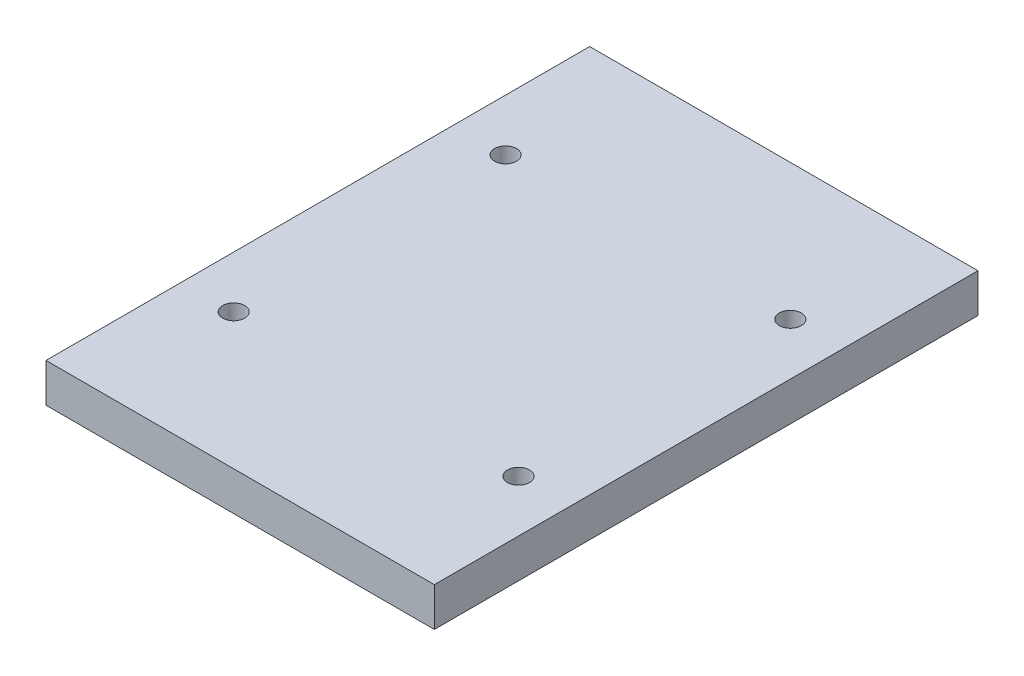
ISO-10303-21;
HEADER;
FILE_DESCRIPTION(('STEP AP214'),'2;1');
FILE_NAME('part.step','',(''),(''),'','','');
FILE_SCHEMA(('AUTOMOTIVE_DESIGN { 1 0 10303 214 1 1 1 1 }'));
ENDSEC;
DATA;
#1=APPLICATION_CONTEXT('core data for automotive mechanical design processes');
#2=APPLICATION_PROTOCOL_DEFINITION('international standard','automotive_design',2000,#1);
#3=PRODUCT_CONTEXT('',#1,'mechanical');
#4=PRODUCT('Part','Part','',(#3));
#5=PRODUCT_RELATED_PRODUCT_CATEGORY('part','',(#4));
#6=PRODUCT_DEFINITION_FORMATION('','',#4);
#7=PRODUCT_DEFINITION_CONTEXT('part definition',#1,'design');
#8=PRODUCT_DEFINITION('design','',#6,#7);
#9=PRODUCT_DEFINITION_SHAPE('','',#8);
#10=(LENGTH_UNIT() NAMED_UNIT(*) SI_UNIT(.MILLI.,.METRE.));
#11=(NAMED_UNIT(*) PLANE_ANGLE_UNIT() SI_UNIT($,.RADIAN.));
#12=(NAMED_UNIT(*) SI_UNIT($,.STERADIAN.) SOLID_ANGLE_UNIT());
#13=UNCERTAINTY_MEASURE_WITH_UNIT(LENGTH_MEASURE(1.E-05),#10,'distance_accuracy_value','');
#14=(GEOMETRIC_REPRESENTATION_CONTEXT(3) GLOBAL_UNCERTAINTY_ASSIGNED_CONTEXT((#13)) GLOBAL_UNIT_ASSIGNED_CONTEXT((#10,
#11,#12)) REPRESENTATION_CONTEXT('',''));
#15=CARTESIAN_POINT('',(0.,0.,0.));
#16=DIRECTION('',(0.,0.,1.));
#17=DIRECTION('',(1.,0.,0.));
#18=AXIS2_PLACEMENT_3D('',#15,#16,#17);
#19=CARTESIAN_POINT('',(0.,-34.4,0.));
#20=DIRECTION('',(0.,1.,0.));
#21=DIRECTION('',(0.,0.,1.));
#22=AXIS2_PLACEMENT_3D('',#19,#20,#21);
#23=PLANE('',#22);
#24=CARTESIAN_POINT('',(-22.,-34.4,49.));
#25=DIRECTION('',(0.,1.,0.));
#26=DIRECTION('',(0.,0.,1.));
#27=AXIS2_PLACEMENT_3D('',#24,#25,#26);
#28=CIRCLE('',#27,3.);
#29=CARTESIAN_POINT('',(-22.,-34.4,52.));
#30=VERTEX_POINT('',#29);
#31=EDGE_CURVE('E173',#30,#30,#28,.F.);
#32=ORIENTED_EDGE('',*,*,#31,.F.);
#33=EDGE_LOOP('',(#32));
#34=FACE_BOUND('',#33,.T.);
#35=CARTESIAN_POINT('',(22.,-34.4,91.));
#36=DIRECTION('',(0.,1.,0.));
#37=DIRECTION('',(0.,0.,1.));
#38=AXIS2_PLACEMENT_3D('',#35,#36,#37);
#39=CIRCLE('',#38,3.);
#40=CARTESIAN_POINT('',(22.,-34.4,94.));
#41=VERTEX_POINT('',#40);
#42=EDGE_CURVE('E201',#41,#41,#39,.F.);
#43=ORIENTED_EDGE('',*,*,#42,.F.);
#44=EDGE_LOOP('',(#43));
#45=FACE_BOUND('',#44,.T.);
#46=CARTESIAN_POINT('',(22.,-34.4,49.));
#47=DIRECTION('',(0.,1.,0.));
#48=DIRECTION('',(0.,0.,1.));
#49=AXIS2_PLACEMENT_3D('',#46,#47,#48);
#50=CIRCLE('',#49,3.);
#51=CARTESIAN_POINT('',(22.,-34.4,52.));
#52=VERTEX_POINT('',#51);
#53=EDGE_CURVE('E198',#52,#52,#50,.F.);
#54=ORIENTED_EDGE('',*,*,#53,.F.);
#55=EDGE_LOOP('',(#54));
#56=FACE_BOUND('',#55,.T.);
#57=CARTESIAN_POINT('',(-22.,-34.4,91.));
#58=DIRECTION('',(0.,1.,0.));
#59=DIRECTION('',(0.,0.,1.));
#60=AXIS2_PLACEMENT_3D('',#57,#58,#59);
#61=CIRCLE('',#60,3.);
#62=CARTESIAN_POINT('',(-22.,-34.4,94.));
#63=VERTEX_POINT('',#62);
#64=EDGE_CURVE('E195',#63,#63,#61,.F.);
#65=ORIENTED_EDGE('',*,*,#64,.F.);
#66=EDGE_LOOP('',(#65));
#67=FACE_BOUND('',#66,.T.);
#68=DIRECTION('',(0.,0.,1.));
#69=VECTOR('',#68,1.);
#70=CARTESIAN_POINT('',(-30.,-34.4,28.));
#71=LINE('',#70,#69);
#72=CARTESIAN_POINT('',(-30.,-34.4,28.));
#73=VERTEX_POINT('',#72);
#74=CARTESIAN_POINT('',(-30.,-34.4,112.));
#75=VERTEX_POINT('',#74);
#76=EDGE_CURVE('E136',#73,#75,#71,.T.);
#77=ORIENTED_EDGE('',*,*,#76,.F.);
#78=DIRECTION('',(-1.,0.,0.));
#79=VECTOR('',#78,1.);
#80=CARTESIAN_POINT('',(30.,-34.4,28.));
#81=LINE('',#80,#79);
#82=CARTESIAN_POINT('',(30.,-34.4,28.));
#83=VERTEX_POINT('',#82);
#84=EDGE_CURVE('E86',#83,#73,#81,.T.);
#85=ORIENTED_EDGE('',*,*,#84,.F.);
#86=DIRECTION('',(0.,0.,-1.));
#87=VECTOR('',#86,1.);
#88=CARTESIAN_POINT('',(30.,-34.4,112.));
#89=LINE('',#88,#87);
#90=CARTESIAN_POINT('',(30.,-34.4,112.));
#91=VERTEX_POINT('',#90);
#92=EDGE_CURVE('E152',#91,#83,#89,.T.);
#93=ORIENTED_EDGE('',*,*,#92,.F.);
#94=DIRECTION('',(1.,0.,0.));
#95=VECTOR('',#94,1.);
#96=CARTESIAN_POINT('',(-30.,-34.4,112.));
#97=LINE('',#96,#95);
#98=EDGE_CURVE('E139',#75,#91,#97,.T.);
#99=ORIENTED_EDGE('',*,*,#98,.F.);
#100=EDGE_LOOP('',(#77,#85,#93,#99));
#101=FACE_BOUND('',#100,.T.);
#102=DIRECTION('',(-1.,0.,0.));
#103=VECTOR('',#102,1.);
#104=CARTESIAN_POINT('',(0.,-34.4,106.));
#105=LINE('',#104,#103);
#106=CARTESIAN_POINT('',(15.,-34.4,106.));
#107=VERTEX_POINT('',#106);
#108=CARTESIAN_POINT('',(-15.,-34.4,106.));
#109=VERTEX_POINT('',#108);
#110=EDGE_CURVE('E11',#107,#109,#105,.T.);
#111=ORIENTED_EDGE('',*,*,#110,.F.);
#112=DIRECTION('',(0.,0.,1.));
#113=VECTOR('',#112,1.);
#114=CARTESIAN_POINT('',(15.,-34.4,0.));
#115=LINE('',#114,#113);
#116=CARTESIAN_POINT('',(15.,-34.4,34.));
#117=VERTEX_POINT('',#116);
#118=EDGE_CURVE('E166',#117,#107,#115,.T.);
#119=ORIENTED_EDGE('',*,*,#118,.F.);
#120=DIRECTION('',(-1.,0.,0.));
#121=VECTOR('',#120,1.);
#122=CARTESIAN_POINT('',(0.,-34.4,34.));
#123=LINE('',#122,#121);
#124=CARTESIAN_POINT('',(-15.,-34.4,34.));
#125=VERTEX_POINT('',#124);
#126=EDGE_CURVE('E163',#117,#125,#123,.T.);
#127=ORIENTED_EDGE('',*,*,#126,.T.);
#128=DIRECTION('',(0.,0.,-1.));
#129=VECTOR('',#128,1.);
#130=CARTESIAN_POINT('',(-15.,-34.4,0.));
#131=LINE('',#130,#129);
#132=EDGE_CURVE('E48',#109,#125,#131,.T.);
#133=ORIENTED_EDGE('',*,*,#132,.F.);
#134=EDGE_LOOP('',(#111,#119,#127,#133));
#135=FACE_BOUND('',#134,.T.);
#136=ADVANCED_FACE('F39',(#34,#45,#56,#67,#101,#135),#23,.F.);
#137=CARTESIAN_POINT('',(-30.,-28.4,28.));
#138=DIRECTION('',(1.,0.,0.));
#139=DIRECTION('',(0.,0.,-1.));
#140=AXIS2_PLACEMENT_3D('',#137,#138,#139);
#141=PLANE('',#140);
#142=ORIENTED_EDGE('',*,*,#76,.T.);
#143=DIRECTION('',(0.,-1.,0.));
#144=VECTOR('',#143,1.);
#145=CARTESIAN_POINT('',(-30.,-28.4,112.));
#146=LINE('',#145,#144);
#147=CARTESIAN_POINT('',(-30.,-28.4,112.));
#148=VERTEX_POINT('',#147);
#149=EDGE_CURVE('E161',#148,#75,#146,.T.);
#150=ORIENTED_EDGE('',*,*,#149,.F.);
#151=DIRECTION('',(0.,0.,1.));
#152=VECTOR('',#151,1.);
#153=CARTESIAN_POINT('',(-30.,-28.4,28.));
#154=LINE('',#153,#152);
#155=CARTESIAN_POINT('',(-30.,-28.4,28.));
#156=VERTEX_POINT('',#155);
#157=EDGE_CURVE('E144',#156,#148,#154,.T.);
#158=ORIENTED_EDGE('',*,*,#157,.F.);
#159=DIRECTION('',(0.,-1.,0.));
#160=VECTOR('',#159,1.);
#161=CARTESIAN_POINT('',(-30.,-28.4,28.));
#162=LINE('',#161,#160);
#163=EDGE_CURVE('E149',#156,#73,#162,.T.);
#164=ORIENTED_EDGE('',*,*,#163,.T.);
#165=EDGE_LOOP('',(#142,#150,#158,#164));
#166=FACE_BOUND('',#165,.T.);
#167=ADVANCED_FACE('F41',(#166),#141,.F.);
#168=CARTESIAN_POINT('',(-30.,-28.4,112.));
#169=DIRECTION('',(0.,0.,-1.));
#170=DIRECTION('',(-1.,0.,0.));
#171=AXIS2_PLACEMENT_3D('',#168,#169,#170);
#172=PLANE('',#171);
#173=ORIENTED_EDGE('',*,*,#98,.T.);
#174=DIRECTION('',(0.,-1.,0.));
#175=VECTOR('',#174,1.);
#176=CARTESIAN_POINT('',(30.,-28.4,112.));
#177=LINE('',#176,#175);
#178=CARTESIAN_POINT('',(30.,-28.4,112.));
#179=VERTEX_POINT('',#178);
#180=EDGE_CURVE('E158',#179,#91,#177,.T.);
#181=ORIENTED_EDGE('',*,*,#180,.F.);
#182=DIRECTION('',(1.,0.,0.));
#183=VECTOR('',#182,1.);
#184=CARTESIAN_POINT('',(-30.,-28.4,112.));
#185=LINE('',#184,#183);
#186=EDGE_CURVE('E94',#148,#179,#185,.T.);
#187=ORIENTED_EDGE('',*,*,#186,.F.);
#188=ORIENTED_EDGE('',*,*,#149,.T.);
#189=EDGE_LOOP('',(#173,#181,#187,#188));
#190=FACE_BOUND('',#189,.T.);
#191=ADVANCED_FACE('F259',(#190),#172,.F.);
#192=CARTESIAN_POINT('',(30.,-28.4,112.));
#193=DIRECTION('',(-1.,0.,0.));
#194=DIRECTION('',(0.,0.,1.));
#195=AXIS2_PLACEMENT_3D('',#192,#193,#194);
#196=PLANE('',#195);
#197=ORIENTED_EDGE('',*,*,#92,.T.);
#198=DIRECTION('',(0.,-1.,0.));
#199=VECTOR('',#198,1.);
#200=CARTESIAN_POINT('',(30.,-28.4,28.));
#201=LINE('',#200,#199);
#202=CARTESIAN_POINT('',(30.,-28.4,28.));
#203=VERTEX_POINT('',#202);
#204=EDGE_CURVE('E156',#203,#83,#201,.T.);
#205=ORIENTED_EDGE('',*,*,#204,.F.);
#206=DIRECTION('',(0.,0.,-1.));
#207=VECTOR('',#206,1.);
#208=CARTESIAN_POINT('',(30.,-28.4,112.));
#209=LINE('',#208,#207);
#210=EDGE_CURVE('E147',#179,#203,#209,.T.);
#211=ORIENTED_EDGE('',*,*,#210,.F.);
#212=ORIENTED_EDGE('',*,*,#180,.T.);
#213=EDGE_LOOP('',(#197,#205,#211,#212));
#214=FACE_BOUND('',#213,.T.);
#215=ADVANCED_FACE('F270',(#214),#196,.F.);
#216=CARTESIAN_POINT('',(30.,-28.4,28.));
#217=DIRECTION('',(0.,0.,1.));
#218=DIRECTION('',(1.,0.,0.));
#219=AXIS2_PLACEMENT_3D('',#216,#217,#218);
#220=PLANE('',#219);
#221=ORIENTED_EDGE('',*,*,#84,.T.);
#222=ORIENTED_EDGE('',*,*,#163,.F.);
#223=DIRECTION('',(-1.,0.,0.));
#224=VECTOR('',#223,1.);
#225=CARTESIAN_POINT('',(30.,-28.4,28.));
#226=LINE('',#225,#224);
#227=EDGE_CURVE('E65',#203,#156,#226,.T.);
#228=ORIENTED_EDGE('',*,*,#227,.F.);
#229=ORIENTED_EDGE('',*,*,#204,.T.);
#230=EDGE_LOOP('',(#221,#222,#228,#229));
#231=FACE_BOUND('',#230,.T.);
#232=ADVANCED_FACE('F267',(#231),#220,.F.);
#233=CARTESIAN_POINT('',(0.,-28.4,0.));
#234=DIRECTION('',(0.,1.,0.));
#235=DIRECTION('',(0.,0.,1.));
#236=AXIS2_PLACEMENT_3D('',#233,#234,#235);
#237=PLANE('',#236);
#238=CARTESIAN_POINT('',(-22.,-28.4,49.));
#239=DIRECTION('',(0.,1.,0.));
#240=DIRECTION('',(0.,0.,1.));
#241=AXIS2_PLACEMENT_3D('',#238,#239,#240);
#242=CIRCLE('',#241,1.7);
#243=CARTESIAN_POINT('',(-22.,-28.4,50.7));
#244=VERTEX_POINT('',#243);
#245=EDGE_CURVE('E179',#244,#244,#242,.F.);
#246=ORIENTED_EDGE('',*,*,#245,.T.);
#247=EDGE_LOOP('',(#246));
#248=FACE_BOUND('',#247,.T.);
#249=CARTESIAN_POINT('',(22.,-28.4,91.));
#250=DIRECTION('',(0.,1.,0.));
#251=DIRECTION('',(0.,0.,1.));
#252=AXIS2_PLACEMENT_3D('',#249,#250,#251);
#253=CIRCLE('',#252,1.7);
#254=CARTESIAN_POINT('',(22.,-28.4,92.7));
#255=VERTEX_POINT('',#254);
#256=EDGE_CURVE('E176',#255,#255,#253,.F.);
#257=ORIENTED_EDGE('',*,*,#256,.T.);
#258=EDGE_LOOP('',(#257));
#259=FACE_BOUND('',#258,.T.);
#260=CARTESIAN_POINT('',(22.,-28.4,49.));
#261=DIRECTION('',(0.,1.,0.));
#262=DIRECTION('',(0.,0.,1.));
#263=AXIS2_PLACEMENT_3D('',#260,#261,#262);
#264=CIRCLE('',#263,1.7);
#265=CARTESIAN_POINT('',(22.,-28.4,50.7));
#266=VERTEX_POINT('',#265);
#267=EDGE_CURVE('E172',#266,#266,#264,.F.);
#268=ORIENTED_EDGE('',*,*,#267,.T.);
#269=EDGE_LOOP('',(#268));
#270=FACE_BOUND('',#269,.T.);
#271=CARTESIAN_POINT('',(-22.,-28.4,91.));
#272=DIRECTION('',(0.,1.,0.));
#273=DIRECTION('',(0.,0.,1.));
#274=AXIS2_PLACEMENT_3D('',#271,#272,#273);
#275=CIRCLE('',#274,1.7);
#276=CARTESIAN_POINT('',(-22.,-28.4,92.7));
#277=VERTEX_POINT('',#276);
#278=EDGE_CURVE('E169',#277,#277,#275,.F.);
#279=ORIENTED_EDGE('',*,*,#278,.T.);
#280=EDGE_LOOP('',(#279));
#281=FACE_BOUND('',#280,.T.);
#282=ORIENTED_EDGE('',*,*,#157,.T.);
#283=ORIENTED_EDGE('',*,*,#186,.T.);
#284=ORIENTED_EDGE('',*,*,#210,.T.);
#285=ORIENTED_EDGE('',*,*,#227,.T.);
#286=EDGE_LOOP('',(#282,#283,#284,#285));
#287=FACE_BOUND('',#286,.T.);
#288=ADVANCED_FACE('F265',(#248,#259,#270,#281,#287),#237,.T.);
#289=CARTESIAN_POINT('',(-19.,-40.4,106.));
#290=DIRECTION('',(0.832050294337844,-0.554700196225229,0.));
#291=DIRECTION('',(0.554700196225229,0.832050294337844,0.));
#292=AXIS2_PLACEMENT_3D('',#289,#290,#291);
#293=PLANE('',#292);
#294=DIRECTION('',(-0.554700196225229,-0.832050294337844,0.));
#295=VECTOR('',#294,1.);
#296=CARTESIAN_POINT('',(-19.,-40.4,106.));
#297=LINE('',#296,#295);
#298=CARTESIAN_POINT('',(-19.,-40.4,106.));
#299=VERTEX_POINT('',#298);
#300=EDGE_CURVE('E114',#109,#299,#297,.T.);
#301=ORIENTED_EDGE('',*,*,#300,.F.);
#302=ORIENTED_EDGE('',*,*,#132,.T.);
#303=DIRECTION('',(-0.554700196225229,-0.832050294337844,0.));
#304=VECTOR('',#303,1.);
#305=CARTESIAN_POINT('',(-19.,-40.4,34.));
#306=LINE('',#305,#304);
#307=CARTESIAN_POINT('',(-19.,-40.4,34.));
#308=VERTEX_POINT('',#307);
#309=EDGE_CURVE('E56',#125,#308,#306,.T.);
#310=ORIENTED_EDGE('',*,*,#309,.T.);
#311=DIRECTION('',(0.,0.,-1.));
#312=VECTOR('',#311,1.);
#313=CARTESIAN_POINT('',(-19.,-40.4,106.));
#314=LINE('',#313,#312);
#315=EDGE_CURVE('E129',#299,#308,#314,.T.);
#316=ORIENTED_EDGE('',*,*,#315,.F.);
#317=EDGE_LOOP('',(#301,#302,#310,#316));
#318=FACE_BOUND('',#317,.T.);
#319=ADVANCED_FACE('F135',(#318),#293,.F.);
#320=CARTESIAN_POINT('',(14.6666666666667,-33.9,106.));
#321=DIRECTION('',(-0.832050294337844,-0.554700196225229,0.));
#322=DIRECTION('',(0.554700196225229,-0.832050294337844,0.));
#323=AXIS2_PLACEMENT_3D('',#320,#321,#322);
#324=PLANE('',#323);
#325=DIRECTION('',(-0.554700196225229,0.832050294337844,0.));
#326=VECTOR('',#325,1.);
#327=CARTESIAN_POINT('',(14.6666666666667,-33.9,34.));
#328=LINE('',#327,#326);
#329=CARTESIAN_POINT('',(19.,-40.4,34.));
#330=VERTEX_POINT('',#329);
#331=EDGE_CURVE('E124',#330,#117,#328,.T.);
#332=ORIENTED_EDGE('',*,*,#331,.T.);
#333=ORIENTED_EDGE('',*,*,#118,.T.);
#334=DIRECTION('',(-0.554700196225229,0.832050294337844,0.));
#335=VECTOR('',#334,1.);
#336=CARTESIAN_POINT('',(14.6666666666667,-33.9,106.));
#337=LINE('',#336,#335);
#338=CARTESIAN_POINT('',(19.,-40.4,106.));
#339=VERTEX_POINT('',#338);
#340=EDGE_CURVE('E133',#339,#107,#337,.T.);
#341=ORIENTED_EDGE('',*,*,#340,.F.);
#342=DIRECTION('',(0.,0.,-1.));
#343=VECTOR('',#342,1.);
#344=CARTESIAN_POINT('',(19.,-40.4,106.));
#345=LINE('',#344,#343);
#346=EDGE_CURVE('E131',#339,#330,#345,.T.);
#347=ORIENTED_EDGE('',*,*,#346,.T.);
#348=EDGE_LOOP('',(#332,#333,#341,#347));
#349=FACE_BOUND('',#348,.T.);
#350=ADVANCED_FACE('F237',(#349),#324,.F.);
#351=CARTESIAN_POINT('',(0.,0.,106.));
#352=DIRECTION('',(0.,0.,-1.));
#353=DIRECTION('',(-1.,0.,0.));
#354=AXIS2_PLACEMENT_3D('',#351,#352,#353);
#355=PLANE('',#354);
#356=ORIENTED_EDGE('',*,*,#340,.T.);
#357=ORIENTED_EDGE('',*,*,#110,.T.);
#358=ORIENTED_EDGE('',*,*,#300,.T.);
#359=DIRECTION('',(1.,0.,0.));
#360=VECTOR('',#359,1.);
#361=CARTESIAN_POINT('',(19.,-40.4,106.));
#362=LINE('',#361,#360);
#363=EDGE_CURVE('E118',#299,#339,#362,.T.);
#364=ORIENTED_EDGE('',*,*,#363,.T.);
#365=EDGE_LOOP('',(#356,#357,#358,#364));
#366=FACE_BOUND('',#365,.T.);
#367=ADVANCED_FACE('F117',(#366),#355,.F.);
#368=CARTESIAN_POINT('',(0.,0.,34.));
#369=DIRECTION('',(0.,0.,-1.));
#370=DIRECTION('',(-1.,0.,0.));
#371=AXIS2_PLACEMENT_3D('',#368,#369,#370);
#372=PLANE('',#371);
#373=ORIENTED_EDGE('',*,*,#126,.F.);
#374=ORIENTED_EDGE('',*,*,#331,.F.);
#375=DIRECTION('',(1.,0.,0.));
#376=VECTOR('',#375,1.);
#377=CARTESIAN_POINT('',(19.,-40.4,34.));
#378=LINE('',#377,#376);
#379=EDGE_CURVE('E232',#308,#330,#378,.T.);
#380=ORIENTED_EDGE('',*,*,#379,.F.);
#381=ORIENTED_EDGE('',*,*,#309,.F.);
#382=EDGE_LOOP('',(#373,#374,#380,#381));
#383=FACE_BOUND('',#382,.T.);
#384=ADVANCED_FACE('F239',(#383),#372,.T.);
#385=CARTESIAN_POINT('',(19.,-40.4,106.));
#386=DIRECTION('',(0.,1.,0.));
#387=DIRECTION('',(0.,0.,1.));
#388=AXIS2_PLACEMENT_3D('',#385,#386,#387);
#389=PLANE('',#388);
#390=CARTESIAN_POINT('',(0.,-40.4,98.));
#391=DIRECTION('',(0.,1.,0.));
#392=DIRECTION('',(0.,0.,1.));
#393=AXIS2_PLACEMENT_3D('',#390,#391,#392);
#394=CIRCLE('',#393,2.25);
#395=CARTESIAN_POINT('',(0.,-40.4,100.25));
#396=VERTEX_POINT('',#395);
#397=EDGE_CURVE('E43',#396,#396,#394,.F.);
#398=ORIENTED_EDGE('',*,*,#397,.F.);
#399=EDGE_LOOP('',(#398));
#400=FACE_BOUND('',#399,.T.);
#401=CARTESIAN_POINT('',(0.,-40.4,42.));
#402=DIRECTION('',(0.,1.,0.));
#403=DIRECTION('',(0.,0.,1.));
#404=AXIS2_PLACEMENT_3D('',#401,#402,#403);
#405=CIRCLE('',#404,2.25);
#406=CARTESIAN_POINT('',(0.,-40.4,44.25));
#407=VERTEX_POINT('',#406);
#408=EDGE_CURVE('E205',#407,#407,#405,.F.);
#409=ORIENTED_EDGE('',*,*,#408,.F.);
#410=EDGE_LOOP('',(#409));
#411=FACE_BOUND('',#410,.T.);
#412=ORIENTED_EDGE('',*,*,#379,.T.);
#413=ORIENTED_EDGE('',*,*,#346,.F.);
#414=ORIENTED_EDGE('',*,*,#363,.F.);
#415=ORIENTED_EDGE('',*,*,#315,.T.);
#416=EDGE_LOOP('',(#412,#413,#414,#415));
#417=FACE_BOUND('',#416,.T.);
#418=ADVANCED_FACE('F128',(#400,#411,#417),#389,.F.);
#419=CARTESIAN_POINT('',(-22.,-27.9,91.));
#420=DIRECTION('',(0.,-1.,0.));
#421=DIRECTION('',(0.,0.,-1.));
#422=AXIS2_PLACEMENT_3D('',#419,#420,#421);
#423=CYLINDRICAL_SURFACE('',#422,1.7);
#424=CARTESIAN_POINT('',(-22.,-30.9,91.));
#425=DIRECTION('',(0.,1.,0.));
#426=DIRECTION('',(0.,0.,1.));
#427=AXIS2_PLACEMENT_3D('',#424,#425,#426);
#428=CIRCLE('',#427,1.7);
#429=CARTESIAN_POINT('',(-22.,-30.9,92.7));
#430=VERTEX_POINT('',#429);
#431=EDGE_CURVE('E192',#430,#430,#428,.T.);
#432=ORIENTED_EDGE('',*,*,#431,.F.);
#433=EDGE_LOOP('',(#432));
#434=FACE_BOUND('',#433,.T.);
#435=ORIENTED_EDGE('',*,*,#278,.F.);
#436=EDGE_LOOP('',(#435));
#437=FACE_BOUND('',#436,.T.);
#438=ADVANCED_FACE('F247',(#434,#437),#423,.F.);
#439=CARTESIAN_POINT('',(22.,-27.9,49.));
#440=DIRECTION('',(0.,-1.,0.));
#441=DIRECTION('',(0.,0.,-1.));
#442=AXIS2_PLACEMENT_3D('',#439,#440,#441);
#443=CYLINDRICAL_SURFACE('',#442,1.7);
#444=CARTESIAN_POINT('',(22.,-30.9,49.));
#445=DIRECTION('',(0.,1.,0.));
#446=DIRECTION('',(0.,0.,1.));
#447=AXIS2_PLACEMENT_3D('',#444,#445,#446);
#448=CIRCLE('',#447,1.7);
#449=CARTESIAN_POINT('',(22.,-30.9,50.7));
#450=VERTEX_POINT('',#449);
#451=EDGE_CURVE('E189',#450,#450,#448,.T.);
#452=ORIENTED_EDGE('',*,*,#451,.F.);
#453=EDGE_LOOP('',(#452));
#454=FACE_BOUND('',#453,.T.);
#455=ORIENTED_EDGE('',*,*,#267,.F.);
#456=EDGE_LOOP('',(#455));
#457=FACE_BOUND('',#456,.T.);
#458=ADVANCED_FACE('F295',(#454,#457),#443,.F.);
#459=CARTESIAN_POINT('',(22.,-27.9,91.));
#460=DIRECTION('',(0.,-1.,0.));
#461=DIRECTION('',(0.,0.,-1.));
#462=AXIS2_PLACEMENT_3D('',#459,#460,#461);
#463=CYLINDRICAL_SURFACE('',#462,1.7);
#464=CARTESIAN_POINT('',(22.,-30.9,91.));
#465=DIRECTION('',(0.,1.,0.));
#466=DIRECTION('',(0.,0.,1.));
#467=AXIS2_PLACEMENT_3D('',#464,#465,#466);
#468=CIRCLE('',#467,1.7);
#469=CARTESIAN_POINT('',(22.,-30.9,92.7));
#470=VERTEX_POINT('',#469);
#471=EDGE_CURVE('E185',#470,#470,#468,.T.);
#472=ORIENTED_EDGE('',*,*,#471,.F.);
#473=EDGE_LOOP('',(#472));
#474=FACE_BOUND('',#473,.T.);
#475=ORIENTED_EDGE('',*,*,#256,.F.);
#476=EDGE_LOOP('',(#475));
#477=FACE_BOUND('',#476,.T.);
#478=ADVANCED_FACE('F301',(#474,#477),#463,.F.);
#479=CARTESIAN_POINT('',(-22.,-27.9,49.));
#480=DIRECTION('',(0.,-1.,0.));
#481=DIRECTION('',(0.,0.,-1.));
#482=AXIS2_PLACEMENT_3D('',#479,#480,#481);
#483=CYLINDRICAL_SURFACE('',#482,1.7);
#484=CARTESIAN_POINT('',(-22.,-30.9,49.));
#485=DIRECTION('',(0.,1.,0.));
#486=DIRECTION('',(0.,0.,1.));
#487=AXIS2_PLACEMENT_3D('',#484,#485,#486);
#488=CIRCLE('',#487,1.7);
#489=CARTESIAN_POINT('',(-22.,-30.9,50.7));
#490=VERTEX_POINT('',#489);
#491=EDGE_CURVE('E182',#490,#490,#488,.T.);
#492=ORIENTED_EDGE('',*,*,#491,.F.);
#493=EDGE_LOOP('',(#492));
#494=FACE_BOUND('',#493,.T.);
#495=ORIENTED_EDGE('',*,*,#245,.F.);
#496=EDGE_LOOP('',(#495));
#497=FACE_BOUND('',#496,.T.);
#498=ADVANCED_FACE('F308',(#494,#497),#483,.F.);
#499=CARTESIAN_POINT('',(-22.,-30.9,49.));
#500=DIRECTION('',(0.,-1.,0.));
#501=DIRECTION('',(0.,0.,-1.));
#502=AXIS2_PLACEMENT_3D('',#499,#500,#501);
#503=CYLINDRICAL_SURFACE('',#502,3.);
#504=CARTESIAN_POINT('',(-22.,-30.9,49.));
#505=DIRECTION('',(0.,1.,0.));
#506=DIRECTION('',(0.,0.,1.));
#507=AXIS2_PLACEMENT_3D('',#504,#505,#506);
#508=CIRCLE('',#507,3.);
#509=CARTESIAN_POINT('',(-22.,-30.9,52.));
#510=VERTEX_POINT('',#509);
#511=EDGE_CURVE('E223',#510,#510,#508,.T.);
#512=ORIENTED_EDGE('',*,*,#511,.T.);
#513=EDGE_LOOP('',(#512));
#514=FACE_BOUND('',#513,.T.);
#515=ORIENTED_EDGE('',*,*,#31,.T.);
#516=EDGE_LOOP('',(#515));
#517=FACE_BOUND('',#516,.T.);
#518=ADVANCED_FACE('F311',(#514,#517),#503,.F.);
#519=CARTESIAN_POINT('',(-22.,-30.9,49.));
#520=DIRECTION('',(0.,1.,0.));
#521=DIRECTION('',(0.,0.,1.));
#522=AXIS2_PLACEMENT_3D('',#519,#520,#521);
#523=PLANE('',#522);
#524=ORIENTED_EDGE('',*,*,#491,.T.);
#525=EDGE_LOOP('',(#524));
#526=FACE_BOUND('',#525,.T.);
#527=ORIENTED_EDGE('',*,*,#511,.F.);
#528=EDGE_LOOP('',(#527));
#529=FACE_BOUND('',#528,.T.);
#530=ADVANCED_FACE('F332',(#526,#529),#523,.F.);
#531=CARTESIAN_POINT('',(22.,-30.9,91.));
#532=DIRECTION('',(0.,-1.,0.));
#533=DIRECTION('',(0.,0.,-1.));
#534=AXIS2_PLACEMENT_3D('',#531,#532,#533);
#535=CYLINDRICAL_SURFACE('',#534,3.);
#536=CARTESIAN_POINT('',(22.,-30.9,91.));
#537=DIRECTION('',(0.,1.,0.));
#538=DIRECTION('',(0.,0.,1.));
#539=AXIS2_PLACEMENT_3D('',#536,#537,#538);
#540=CIRCLE('',#539,3.);
#541=CARTESIAN_POINT('',(22.,-30.9,94.));
#542=VERTEX_POINT('',#541);
#543=EDGE_CURVE('E222',#542,#542,#540,.T.);
#544=ORIENTED_EDGE('',*,*,#543,.T.);
#545=EDGE_LOOP('',(#544));
#546=FACE_BOUND('',#545,.T.);
#547=ORIENTED_EDGE('',*,*,#42,.T.);
#548=EDGE_LOOP('',(#547));
#549=FACE_BOUND('',#548,.T.);
#550=ADVANCED_FACE('F328',(#546,#549),#535,.F.);
#551=CARTESIAN_POINT('',(22.,-30.9,91.));
#552=DIRECTION('',(0.,1.,0.));
#553=DIRECTION('',(0.,0.,1.));
#554=AXIS2_PLACEMENT_3D('',#551,#552,#553);
#555=PLANE('',#554);
#556=ORIENTED_EDGE('',*,*,#471,.T.);
#557=EDGE_LOOP('',(#556));
#558=FACE_BOUND('',#557,.T.);
#559=ORIENTED_EDGE('',*,*,#543,.F.);
#560=EDGE_LOOP('',(#559));
#561=FACE_BOUND('',#560,.T.);
#562=ADVANCED_FACE('F324',(#558,#561),#555,.F.);
#563=CARTESIAN_POINT('',(22.,-30.9,49.));
#564=DIRECTION('',(0.,-1.,0.));
#565=DIRECTION('',(0.,0.,-1.));
#566=AXIS2_PLACEMENT_3D('',#563,#564,#565);
#567=CYLINDRICAL_SURFACE('',#566,3.);
#568=CARTESIAN_POINT('',(22.,-30.9,49.));
#569=DIRECTION('',(0.,1.,0.));
#570=DIRECTION('',(0.,0.,1.));
#571=AXIS2_PLACEMENT_3D('',#568,#569,#570);
#572=CIRCLE('',#571,3.);
#573=CARTESIAN_POINT('',(22.,-30.9,52.));
#574=VERTEX_POINT('',#573);
#575=EDGE_CURVE('E211',#574,#574,#572,.T.);
#576=ORIENTED_EDGE('',*,*,#575,.T.);
#577=EDGE_LOOP('',(#576));
#578=FACE_BOUND('',#577,.T.);
#579=ORIENTED_EDGE('',*,*,#53,.T.);
#580=EDGE_LOOP('',(#579));
#581=FACE_BOUND('',#580,.T.);
#582=ADVANCED_FACE('F327',(#578,#581),#567,.F.);
#583=CARTESIAN_POINT('',(22.,-30.9,49.));
#584=DIRECTION('',(0.,1.,0.));
#585=DIRECTION('',(0.,0.,1.));
#586=AXIS2_PLACEMENT_3D('',#583,#584,#585);
#587=PLANE('',#586);
#588=ORIENTED_EDGE('',*,*,#451,.T.);
#589=EDGE_LOOP('',(#588));
#590=FACE_BOUND('',#589,.T.);
#591=ORIENTED_EDGE('',*,*,#575,.F.);
#592=EDGE_LOOP('',(#591));
#593=FACE_BOUND('',#592,.T.);
#594=ADVANCED_FACE('F318',(#590,#593),#587,.F.);
#595=CARTESIAN_POINT('',(-22.,-30.9,91.));
#596=DIRECTION('',(0.,-1.,0.));
#597=DIRECTION('',(0.,0.,-1.));
#598=AXIS2_PLACEMENT_3D('',#595,#596,#597);
#599=CYLINDRICAL_SURFACE('',#598,3.);
#600=CARTESIAN_POINT('',(-22.,-30.9,91.));
#601=DIRECTION('',(0.,1.,0.));
#602=DIRECTION('',(0.,0.,1.));
#603=AXIS2_PLACEMENT_3D('',#600,#601,#602);
#604=CIRCLE('',#603,3.);
#605=CARTESIAN_POINT('',(-22.,-30.9,94.));
#606=VERTEX_POINT('',#605);
#607=EDGE_CURVE('E186',#606,#606,#604,.T.);
#608=ORIENTED_EDGE('',*,*,#607,.T.);
#609=EDGE_LOOP('',(#608));
#610=FACE_BOUND('',#609,.T.);
#611=ORIENTED_EDGE('',*,*,#64,.T.);
#612=EDGE_LOOP('',(#611));
#613=FACE_BOUND('',#612,.T.);
#614=ADVANCED_FACE('F314',(#610,#613),#599,.F.);
#615=CARTESIAN_POINT('',(-22.,-30.9,91.));
#616=DIRECTION('',(0.,1.,0.));
#617=DIRECTION('',(0.,0.,1.));
#618=AXIS2_PLACEMENT_3D('',#615,#616,#617);
#619=PLANE('',#618);
#620=ORIENTED_EDGE('',*,*,#431,.T.);
#621=EDGE_LOOP('',(#620));
#622=FACE_BOUND('',#621,.T.);
#623=ORIENTED_EDGE('',*,*,#607,.F.);
#624=EDGE_LOOP('',(#623));
#625=FACE_BOUND('',#624,.T.);
#626=ADVANCED_FACE('F317',(#622,#625),#619,.F.);
#627=CARTESIAN_POINT('',(0.,-38.4,42.));
#628=DIRECTION('',(0.,-1.,0.));
#629=DIRECTION('',(0.,0.,-1.));
#630=AXIS2_PLACEMENT_3D('',#627,#628,#629);
#631=CYLINDRICAL_SURFACE('',#630,2.25);
#632=CARTESIAN_POINT('',(0.,-38.4,42.));
#633=DIRECTION('',(0.,1.,0.));
#634=DIRECTION('',(0.,0.,1.));
#635=AXIS2_PLACEMENT_3D('',#632,#633,#634);
#636=CIRCLE('',#635,2.25);
#637=CARTESIAN_POINT('',(0.,-38.4,44.25));
#638=VERTEX_POINT('',#637);
#639=EDGE_CURVE('E213',#638,#638,#636,.T.);
#640=ORIENTED_EDGE('',*,*,#639,.T.);
#641=EDGE_LOOP('',(#640));
#642=FACE_BOUND('',#641,.T.);
#643=ORIENTED_EDGE('',*,*,#408,.T.);
#644=EDGE_LOOP('',(#643));
#645=FACE_BOUND('',#644,.T.);
#646=ADVANCED_FACE('F322',(#642,#645),#631,.F.);
#647=CARTESIAN_POINT('',(0.,-38.4,42.));
#648=DIRECTION('',(0.,1.,0.));
#649=DIRECTION('',(0.,0.,1.));
#650=AXIS2_PLACEMENT_3D('',#647,#648,#649);
#651=PLANE('',#650);
#652=ORIENTED_EDGE('',*,*,#639,.F.);
#653=EDGE_LOOP('',(#652));
#654=FACE_BOUND('',#653,.T.);
#655=ADVANCED_FACE('F346',(#654),#651,.F.);
#656=CARTESIAN_POINT('',(0.,-38.4,98.));
#657=DIRECTION('',(0.,-1.,0.));
#658=DIRECTION('',(0.,0.,-1.));
#659=AXIS2_PLACEMENT_3D('',#656,#657,#658);
#660=CYLINDRICAL_SURFACE('',#659,2.25);
#661=CARTESIAN_POINT('',(0.,-38.4,98.));
#662=DIRECTION('',(0.,1.,0.));
#663=DIRECTION('',(0.,0.,1.));
#664=AXIS2_PLACEMENT_3D('',#661,#662,#663);
#665=CIRCLE('',#664,2.25);
#666=CARTESIAN_POINT('',(0.,-38.4,100.25));
#667=VERTEX_POINT('',#666);
#668=EDGE_CURVE('E207',#667,#667,#665,.T.);
#669=ORIENTED_EDGE('',*,*,#668,.T.);
#670=EDGE_LOOP('',(#669));
#671=FACE_BOUND('',#670,.T.);
#672=ORIENTED_EDGE('',*,*,#397,.T.);
#673=EDGE_LOOP('',(#672));
#674=FACE_BOUND('',#673,.T.);
#675=ADVANCED_FACE('F349',(#671,#674),#660,.F.);
#676=CARTESIAN_POINT('',(0.,-38.4,98.));
#677=DIRECTION('',(0.,1.,0.));
#678=DIRECTION('',(0.,0.,1.));
#679=AXIS2_PLACEMENT_3D('',#676,#677,#678);
#680=PLANE('',#679);
#681=ORIENTED_EDGE('',*,*,#668,.F.);
#682=EDGE_LOOP('',(#681));
#683=FACE_BOUND('',#682,.T.);
#684=ADVANCED_FACE('F356',(#683),#680,.F.);
#685=CLOSED_SHELL('',(#136,#167,#191,#215,#232,#288,#319,#350,#367,#384,#418,#438,#458,#478,
#498,#518,#530,#550,#562,#582,#594,#614,#626,#646,#655,#675,#684));
#686=MANIFOLD_SOLID_BREP('B2',#685);
#687=ADVANCED_BREP_SHAPE_REPRESENTATION('',(#18,#686),#14);
#688=SHAPE_DEFINITION_REPRESENTATION(#9,#687);
ENDSEC;
END-ISO-10303-21;
